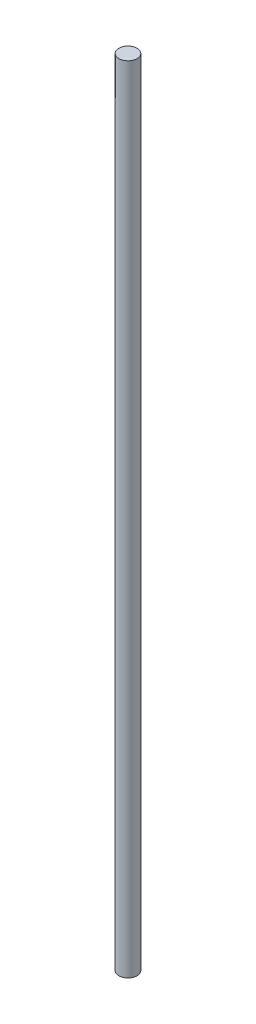
ISO-10303-21;
HEADER;
FILE_DESCRIPTION(('STEP AP214'),'2;1');
FILE_NAME('part.step','',(''),(''),'','','');
FILE_SCHEMA(('AUTOMOTIVE_DESIGN { 1 0 10303 214 1 1 1 1 }'));
ENDSEC;
DATA;
#1=APPLICATION_CONTEXT('core data for automotive mechanical design processes');
#2=APPLICATION_PROTOCOL_DEFINITION('international standard','automotive_design',2000,#1);
#3=PRODUCT_CONTEXT('',#1,'mechanical');
#4=PRODUCT('Part','Part','',(#3));
#5=PRODUCT_RELATED_PRODUCT_CATEGORY('part','',(#4));
#6=PRODUCT_DEFINITION_FORMATION('','',#4);
#7=PRODUCT_DEFINITION_CONTEXT('part definition',#1,'design');
#8=PRODUCT_DEFINITION('design','',#6,#7);
#9=PRODUCT_DEFINITION_SHAPE('','',#8);
#10=(LENGTH_UNIT() NAMED_UNIT(*) SI_UNIT(.MILLI.,.METRE.));
#11=(NAMED_UNIT(*) PLANE_ANGLE_UNIT() SI_UNIT($,.RADIAN.));
#12=(NAMED_UNIT(*) SI_UNIT($,.STERADIAN.) SOLID_ANGLE_UNIT());
#13=UNCERTAINTY_MEASURE_WITH_UNIT(LENGTH_MEASURE(1.E-05),#10,'distance_accuracy_value','');
#14=(GEOMETRIC_REPRESENTATION_CONTEXT(3) GLOBAL_UNCERTAINTY_ASSIGNED_CONTEXT((#13)) GLOBAL_UNIT_ASSIGNED_CONTEXT((#10,
#11,#12)) REPRESENTATION_CONTEXT('',''));
#15=CARTESIAN_POINT('',(0.,0.,0.));
#16=DIRECTION('',(0.,0.,1.));
#17=DIRECTION('',(1.,0.,0.));
#18=AXIS2_PLACEMENT_3D('',#15,#16,#17);
#19=CARTESIAN_POINT('',(0.,263.,0.));
#20=DIRECTION('',(0.,-1.,0.));
#21=DIRECTION('',(0.,0.,-1.));
#22=AXIS2_PLACEMENT_3D('',#19,#20,#21);
#23=CYLINDRICAL_SURFACE('',#22,3.);
#24=CARTESIAN_POINT('',(0.,263.,0.));
#25=DIRECTION('',(0.,1.,0.));
#26=DIRECTION('',(0.,0.,1.));
#27=AXIS2_PLACEMENT_3D('',#24,#25,#26);
#28=CIRCLE('',#27,3.);
#29=CARTESIAN_POINT('',(0.,263.,3.));
#30=VERTEX_POINT('',#29);
#31=EDGE_CURVE('E10',#30,#30,#28,.T.);
#32=ORIENTED_EDGE('',*,*,#31,.F.);
#33=EDGE_LOOP('',(#32));
#34=FACE_BOUND('',#33,.T.);
#35=CARTESIAN_POINT('',(0.,0.,0.));
#36=DIRECTION('',(0.,1.,0.));
#37=DIRECTION('',(0.,0.,1.));
#38=AXIS2_PLACEMENT_3D('',#35,#36,#37);
#39=CIRCLE('',#38,3.);
#40=CARTESIAN_POINT('',(0.,0.,3.));
#41=VERTEX_POINT('',#40);
#42=EDGE_CURVE('E34',#41,#41,#39,.T.);
#43=ORIENTED_EDGE('',*,*,#42,.T.);
#44=EDGE_LOOP('',(#43));
#45=FACE_BOUND('',#44,.T.);
#46=ADVANCED_FACE('F31',(#34,#45),#23,.T.);
#47=CARTESIAN_POINT('',(0.,263.,0.));
#48=DIRECTION('',(0.,1.,0.));
#49=DIRECTION('',(0.,0.,1.));
#50=AXIS2_PLACEMENT_3D('',#47,#48,#49);
#51=PLANE('',#50);
#52=ORIENTED_EDGE('',*,*,#31,.T.);
#53=EDGE_LOOP('',(#52));
#54=FACE_BOUND('',#53,.T.);
#55=ADVANCED_FACE('F46',(#54),#51,.T.);
#56=CARTESIAN_POINT('',(0.,0.,0.));
#57=DIRECTION('',(0.,1.,0.));
#58=DIRECTION('',(0.,0.,1.));
#59=AXIS2_PLACEMENT_3D('',#56,#57,#58);
#60=PLANE('',#59);
#61=ORIENTED_EDGE('',*,*,#42,.F.);
#62=EDGE_LOOP('',(#61));
#63=FACE_BOUND('',#62,.T.);
#64=ADVANCED_FACE('F44',(#63),#60,.F.);
#65=CLOSED_SHELL('',(#46,#55,#64));
#66=MANIFOLD_SOLID_BREP('B2',#65);
#67=ADVANCED_BREP_SHAPE_REPRESENTATION('',(#18,#66),#14);
#68=SHAPE_DEFINITION_REPRESENTATION(#9,#67);
ENDSEC;
END-ISO-10303-21;
